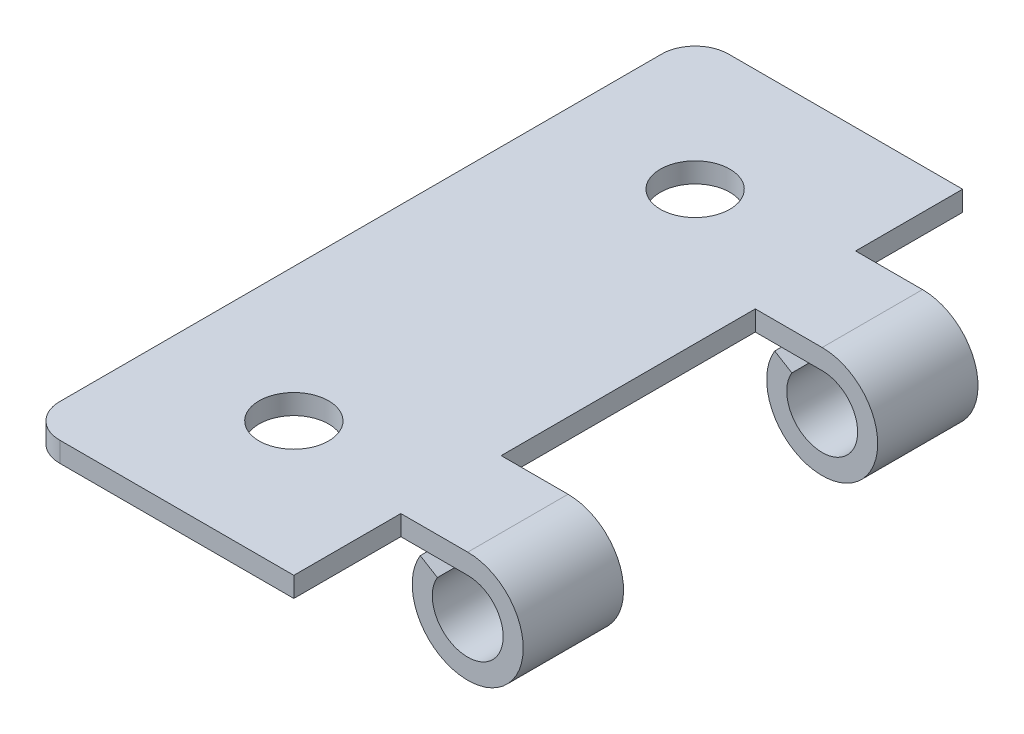
ISO-10303-21;
HEADER;
FILE_DESCRIPTION(('STEP AP214'),'2;1');
FILE_NAME('part.step','',(''),(''),'','','');
FILE_SCHEMA(('AUTOMOTIVE_DESIGN { 1 0 10303 214 1 1 1 1 }'));
ENDSEC;
DATA;
#1=APPLICATION_CONTEXT('core data for automotive mechanical design processes');
#2=APPLICATION_PROTOCOL_DEFINITION('international standard','automotive_design',2000,#1);
#3=PRODUCT_CONTEXT('',#1,'mechanical');
#4=PRODUCT('Part','Part','',(#3));
#5=PRODUCT_RELATED_PRODUCT_CATEGORY('part','',(#4));
#6=PRODUCT_DEFINITION_FORMATION('','',#4);
#7=PRODUCT_DEFINITION_CONTEXT('part definition',#1,'design');
#8=PRODUCT_DEFINITION('design','',#6,#7);
#9=PRODUCT_DEFINITION_SHAPE('','',#8);
#10=(LENGTH_UNIT() NAMED_UNIT(*) SI_UNIT(.MILLI.,.METRE.));
#11=(NAMED_UNIT(*) PLANE_ANGLE_UNIT() SI_UNIT($,.RADIAN.));
#12=(NAMED_UNIT(*) SI_UNIT($,.STERADIAN.) SOLID_ANGLE_UNIT());
#13=UNCERTAINTY_MEASURE_WITH_UNIT(LENGTH_MEASURE(1.E-05),#10,'distance_accuracy_value','');
#14=(GEOMETRIC_REPRESENTATION_CONTEXT(3) GLOBAL_UNCERTAINTY_ASSIGNED_CONTEXT((#13)) GLOBAL_UNIT_ASSIGNED_CONTEXT((#10,
#11,#12)) REPRESENTATION_CONTEXT('',''));
#15=CARTESIAN_POINT('',(0.,0.,0.));
#16=DIRECTION('',(0.,0.,1.));
#17=DIRECTION('',(1.,0.,0.));
#18=AXIS2_PLACEMENT_3D('',#15,#16,#17);
#19=CARTESIAN_POINT('',(12.5,-4.15,25.));
#20=DIRECTION('',(0.,0.,-1.));
#21=DIRECTION('',(-1.,0.,0.));
#22=AXIS2_PLACEMENT_3D('',#19,#20,#21);
#23=CYLINDRICAL_SURFACE('',#22,2.65);
#24=DIRECTION('',(0.,0.,-1.));
#25=VECTOR('',#24,1.);
#26=CARTESIAN_POINT('',(10.2333573843064,-2.77710843373494,25.));
#27=LINE('',#26,#25);
#28=CARTESIAN_POINT('',(10.2333573843064,-2.77710843373494,-9.5));
#29=VERTEX_POINT('',#28);
#30=CARTESIAN_POINT('',(10.2333573843064,-2.77710843373494,-17.));
#31=VERTEX_POINT('',#30);
#32=EDGE_CURVE('E266',#29,#31,#27,.T.);
#33=ORIENTED_EDGE('',*,*,#32,.F.);
#34=CARTESIAN_POINT('',(12.5,-4.15,-9.5));
#35=DIRECTION('',(0.,0.,-1.));
#36=DIRECTION('',(-1.,0.,0.));
#37=AXIS2_PLACEMENT_3D('',#34,#35,#36);
#38=CIRCLE('',#37,2.65);
#39=CARTESIAN_POINT('',(12.5,-1.5,-9.5));
#40=VERTEX_POINT('',#39);
#41=EDGE_CURVE('E212',#29,#40,#38,.F.);
#42=ORIENTED_EDGE('',*,*,#41,.T.);
#43=DIRECTION('',(0.,0.,-1.));
#44=VECTOR('',#43,1.);
#45=CARTESIAN_POINT('',(12.5,-1.5,25.));
#46=LINE('',#45,#44);
#47=CARTESIAN_POINT('',(12.5,-1.5,-17.));
#48=VERTEX_POINT('',#47);
#49=EDGE_CURVE('E251',#40,#48,#46,.T.);
#50=ORIENTED_EDGE('',*,*,#49,.T.);
#51=CARTESIAN_POINT('',(12.5,-4.15,-17.));
#52=DIRECTION('',(0.,0.,1.));
#53=DIRECTION('',(1.,0.,0.));
#54=AXIS2_PLACEMENT_3D('',#51,#52,#53);
#55=CIRCLE('',#54,2.65);
#56=EDGE_CURVE('E237',#48,#31,#55,.F.);
#57=ORIENTED_EDGE('',*,*,#56,.T.);
#58=EDGE_LOOP('',(#33,#42,#50,#57));
#59=FACE_BOUND('',#58,.T.);
#60=ADVANCED_FACE('F38',(#59),#23,.F.);
#61=CARTESIAN_POINT('',(8.95035213014023,-2.,25.));
#62=DIRECTION('',(0.518072289156626,0.855336836110788,0.));
#63=DIRECTION('',(-0.855336836110788,0.518072289156627,0.));
#64=AXIS2_PLACEMENT_3D('',#61,#62,#63);
#65=PLANE('',#64);
#66=DIRECTION('',(-0.855336836110788,0.518072289156627,0.));
#67=VECTOR('',#66,1.);
#68=CARTESIAN_POINT('',(8.95035213014023,-2.,-9.5));
#69=LINE('',#68,#67);
#70=CARTESIAN_POINT('',(8.95035213014023,-2.,-9.5));
#71=VERTEX_POINT('',#70);
#72=EDGE_CURVE('E215',#29,#71,#69,.T.);
#73=ORIENTED_EDGE('',*,*,#72,.F.);
#74=ORIENTED_EDGE('',*,*,#32,.T.);
#75=DIRECTION('',(0.855336836110788,-0.518072289156627,0.));
#76=VECTOR('',#75,1.);
#77=CARTESIAN_POINT('',(8.95035213014023,-2.,-17.));
#78=LINE('',#77,#76);
#79=CARTESIAN_POINT('',(8.95035213014023,-2.,-17.));
#80=VERTEX_POINT('',#79);
#81=EDGE_CURVE('E240',#80,#31,#78,.T.);
#82=ORIENTED_EDGE('',*,*,#81,.F.);
#83=DIRECTION('',(0.,0.,-1.));
#84=VECTOR('',#83,1.);
#85=CARTESIAN_POINT('',(8.95035213014023,-2.,25.));
#86=LINE('',#85,#84);
#87=EDGE_CURVE('E263',#71,#80,#86,.T.);
#88=ORIENTED_EDGE('',*,*,#87,.F.);
#89=EDGE_LOOP('',(#73,#74,#82,#88));
#90=FACE_BOUND('',#89,.T.);
#91=ADVANCED_FACE('F363',(#90),#65,.T.);
#92=CARTESIAN_POINT('',(12.5,-4.15,25.));
#93=DIRECTION('',(0.,0.,-1.));
#94=DIRECTION('',(-1.,0.,0.));
#95=AXIS2_PLACEMENT_3D('',#92,#93,#94);
#96=CYLINDRICAL_SURFACE('',#95,4.15);
#97=CARTESIAN_POINT('',(12.5,-4.15,-9.5));
#98=DIRECTION('',(0.,0.,-1.));
#99=DIRECTION('',(-1.,0.,0.));
#100=AXIS2_PLACEMENT_3D('',#97,#98,#99);
#101=CIRCLE('',#100,4.15);
#102=CARTESIAN_POINT('',(12.5,0.,-9.5));
#103=VERTEX_POINT('',#102);
#104=EDGE_CURVE('E218',#71,#103,#101,.F.);
#105=ORIENTED_EDGE('',*,*,#104,.F.);
#106=ORIENTED_EDGE('',*,*,#87,.T.);
#107=CARTESIAN_POINT('',(12.5,-4.15,-17.));
#108=DIRECTION('',(0.,0.,1.));
#109=DIRECTION('',(1.,0.,0.));
#110=AXIS2_PLACEMENT_3D('',#107,#108,#109);
#111=CIRCLE('',#110,4.15);
#112=CARTESIAN_POINT('',(12.5,0.,-17.));
#113=VERTEX_POINT('',#112);
#114=EDGE_CURVE('E243',#113,#80,#111,.F.);
#115=ORIENTED_EDGE('',*,*,#114,.F.);
#116=DIRECTION('',(0.,0.,-1.));
#117=VECTOR('',#116,1.);
#118=CARTESIAN_POINT('',(12.5,0.,25.));
#119=LINE('',#118,#117);
#120=EDGE_CURVE('E260',#103,#113,#119,.T.);
#121=ORIENTED_EDGE('',*,*,#120,.F.);
#122=EDGE_LOOP('',(#105,#106,#115,#121));
#123=FACE_BOUND('',#122,.T.);
#124=ADVANCED_FACE('F355',(#123),#96,.T.);
#125=CARTESIAN_POINT('',(10.2333573843064,-2.77710843373494,17.));
#126=VERTEX_POINT('',#125);
#127=CARTESIAN_POINT('',(10.2333573843064,-2.77710843373494,9.5));
#128=VERTEX_POINT('',#127);
#129=EDGE_CURVE('E268',#126,#128,#27,.T.);
#130=ORIENTED_EDGE('',*,*,#129,.F.);
#131=CARTESIAN_POINT('',(12.5,-4.15,17.));
#132=DIRECTION('',(0.,0.,-1.));
#133=DIRECTION('',(-1.,0.,0.));
#134=AXIS2_PLACEMENT_3D('',#131,#132,#133);
#135=CIRCLE('',#134,2.65);
#136=CARTESIAN_POINT('',(12.5,-1.5,17.));
#137=VERTEX_POINT('',#136);
#138=EDGE_CURVE('E220',#126,#137,#135,.F.);
#139=ORIENTED_EDGE('',*,*,#138,.T.);
#140=CARTESIAN_POINT('',(12.5,-1.5,9.5));
#141=VERTEX_POINT('',#140);
#142=EDGE_CURVE('E255',#137,#141,#46,.T.);
#143=ORIENTED_EDGE('',*,*,#142,.T.);
#144=CARTESIAN_POINT('',(12.5,-4.15,9.5));
#145=DIRECTION('',(0.,0.,1.));
#146=DIRECTION('',(1.,0.,0.));
#147=AXIS2_PLACEMENT_3D('',#144,#145,#146);
#148=CIRCLE('',#147,2.65);
#149=EDGE_CURVE('E205',#141,#128,#148,.F.);
#150=ORIENTED_EDGE('',*,*,#149,.T.);
#151=EDGE_LOOP('',(#130,#139,#143,#150));
#152=FACE_BOUND('',#151,.T.);
#153=ADVANCED_FACE('F330',(#152),#23,.F.);
#154=DIRECTION('',(-0.855336836110788,0.518072289156627,0.));
#155=VECTOR('',#154,1.);
#156=CARTESIAN_POINT('',(8.95035213014023,-2.,17.));
#157=LINE('',#156,#155);
#158=CARTESIAN_POINT('',(8.95035213014023,-2.,17.));
#159=VERTEX_POINT('',#158);
#160=EDGE_CURVE('E223',#126,#159,#157,.T.);
#161=ORIENTED_EDGE('',*,*,#160,.F.);
#162=ORIENTED_EDGE('',*,*,#129,.T.);
#163=DIRECTION('',(0.855336836110788,-0.518072289156627,0.));
#164=VECTOR('',#163,1.);
#165=CARTESIAN_POINT('',(8.95035213014023,-2.,9.5));
#166=LINE('',#165,#164);
#167=CARTESIAN_POINT('',(8.95035213014023,-2.,9.5));
#168=VERTEX_POINT('',#167);
#169=EDGE_CURVE('E208',#168,#128,#166,.T.);
#170=ORIENTED_EDGE('',*,*,#169,.F.);
#171=EDGE_CURVE('E265',#159,#168,#86,.T.);
#172=ORIENTED_EDGE('',*,*,#171,.F.);
#173=EDGE_LOOP('',(#161,#162,#170,#172));
#174=FACE_BOUND('',#173,.T.);
#175=ADVANCED_FACE('F334',(#174),#65,.T.);
#176=CARTESIAN_POINT('',(12.5,-4.15,17.));
#177=DIRECTION('',(0.,0.,-1.));
#178=DIRECTION('',(-1.,0.,0.));
#179=AXIS2_PLACEMENT_3D('',#176,#177,#178);
#180=CIRCLE('',#179,4.15);
#181=CARTESIAN_POINT('',(12.5,0.,17.));
#182=VERTEX_POINT('',#181);
#183=EDGE_CURVE('E180',#159,#182,#180,.F.);
#184=ORIENTED_EDGE('',*,*,#183,.F.);
#185=ORIENTED_EDGE('',*,*,#171,.T.);
#186=CARTESIAN_POINT('',(12.5,-4.15,9.5));
#187=DIRECTION('',(0.,0.,1.));
#188=DIRECTION('',(1.,0.,0.));
#189=AXIS2_PLACEMENT_3D('',#186,#187,#188);
#190=CIRCLE('',#189,4.15);
#191=CARTESIAN_POINT('',(12.5,0.,9.5));
#192=VERTEX_POINT('',#191);
#193=EDGE_CURVE('E210',#192,#168,#190,.F.);
#194=ORIENTED_EDGE('',*,*,#193,.F.);
#195=EDGE_CURVE('E262',#182,#192,#119,.T.);
#196=ORIENTED_EDGE('',*,*,#195,.F.);
#197=EDGE_LOOP('',(#184,#185,#194,#196));
#198=FACE_BOUND('',#197,.T.);
#199=ADVANCED_FACE('F339',(#198),#96,.T.);
#200=CARTESIAN_POINT('',(-12.5,0.,25.));
#201=DIRECTION('',(0.,1.,0.));
#202=DIRECTION('',(-1.,0.,0.));
#203=AXIS2_PLACEMENT_3D('',#200,#201,#202);
#204=PLANE('',#203);
#205=CARTESIAN_POINT('',(-2.5,0.,15.));
#206=DIRECTION('',(0.,1.,0.));
#207=DIRECTION('',(-1.,0.,0.));
#208=AXIS2_PLACEMENT_3D('',#205,#206,#207);
#209=CIRCLE('',#208,2.6);
#210=CARTESIAN_POINT('',(-5.1,0.,15.));
#211=VERTEX_POINT('',#210);
#212=EDGE_CURVE('E295',#211,#211,#209,.T.);
#213=ORIENTED_EDGE('',*,*,#212,.F.);
#214=EDGE_LOOP('',(#213));
#215=FACE_BOUND('',#214,.T.);
#216=CARTESIAN_POINT('',(-2.5,0.,-15.));
#217=DIRECTION('',(0.,1.,0.));
#218=DIRECTION('',(-1.,0.,0.));
#219=AXIS2_PLACEMENT_3D('',#216,#217,#218);
#220=CIRCLE('',#219,2.6);
#221=CARTESIAN_POINT('',(-5.1,0.,-15.));
#222=VERTEX_POINT('',#221);
#223=EDGE_CURVE('E291',#222,#222,#220,.T.);
#224=ORIENTED_EDGE('',*,*,#223,.F.);
#225=EDGE_LOOP('',(#224));
#226=FACE_BOUND('',#225,.T.);
#227=DIRECTION('',(1.,0.,0.));
#228=VECTOR('',#227,1.);
#229=CARTESIAN_POINT('',(-12.5,0.,-25.));
#230=LINE('',#229,#228);
#231=CARTESIAN_POINT('',(-10.,0.,-25.));
#232=VERTEX_POINT('',#231);
#233=CARTESIAN_POINT('',(7.5,0.,-25.));
#234=VERTEX_POINT('',#233);
#235=EDGE_CURVE('E246',#232,#234,#230,.T.);
#236=ORIENTED_EDGE('',*,*,#235,.F.);
#237=CARTESIAN_POINT('',(-10.,0.,-22.5));
#238=DIRECTION('',(0.,1.,0.));
#239=DIRECTION('',(-1.,0.,0.));
#240=AXIS2_PLACEMENT_3D('',#237,#238,#239);
#241=CIRCLE('',#240,2.5);
#242=CARTESIAN_POINT('',(-12.5,0.,-22.5));
#243=VERTEX_POINT('',#242);
#244=EDGE_CURVE('E300',#232,#243,#241,.T.);
#245=ORIENTED_EDGE('',*,*,#244,.T.);
#246=DIRECTION('',(0.,0.,-1.));
#247=VECTOR('',#246,1.);
#248=CARTESIAN_POINT('',(-12.5,0.,25.));
#249=LINE('',#248,#247);
#250=CARTESIAN_POINT('',(-12.5,0.,22.5));
#251=VERTEX_POINT('',#250);
#252=EDGE_CURVE('E258',#251,#243,#249,.T.);
#253=ORIENTED_EDGE('',*,*,#252,.F.);
#254=CARTESIAN_POINT('',(-10.,0.,22.5));
#255=DIRECTION('',(0.,1.,0.));
#256=DIRECTION('',(-1.,0.,0.));
#257=AXIS2_PLACEMENT_3D('',#254,#255,#256);
#258=CIRCLE('',#257,2.5);
#259=CARTESIAN_POINT('',(-10.,0.,25.));
#260=VERTEX_POINT('',#259);
#261=EDGE_CURVE('E298',#251,#260,#258,.T.);
#262=ORIENTED_EDGE('',*,*,#261,.T.);
#263=DIRECTION('',(1.,0.,0.));
#264=VECTOR('',#263,1.);
#265=CARTESIAN_POINT('',(-12.5,0.,25.));
#266=LINE('',#265,#264);
#267=CARTESIAN_POINT('',(7.5,0.,25.));
#268=VERTEX_POINT('',#267);
#269=EDGE_CURVE('E188',#260,#268,#266,.T.);
#270=ORIENTED_EDGE('',*,*,#269,.T.);
#271=DIRECTION('',(0.,0.,1.));
#272=VECTOR('',#271,1.);
#273=CARTESIAN_POINT('',(7.5,0.,25.));
#274=LINE('',#273,#272);
#275=CARTESIAN_POINT('',(7.5,0.,17.));
#276=VERTEX_POINT('',#275);
#277=EDGE_CURVE('E169',#276,#268,#274,.T.);
#278=ORIENTED_EDGE('',*,*,#277,.F.);
#279=DIRECTION('',(-1.,0.,0.));
#280=VECTOR('',#279,1.);
#281=CARTESIAN_POINT('',(16.65,0.,17.));
#282=LINE('',#281,#280);
#283=EDGE_CURVE('E177',#182,#276,#282,.T.);
#284=ORIENTED_EDGE('',*,*,#283,.F.);
#285=ORIENTED_EDGE('',*,*,#195,.T.);
#286=DIRECTION('',(1.,0.,0.));
#287=VECTOR('',#286,1.);
#288=CARTESIAN_POINT('',(7.5,0.,9.5));
#289=LINE('',#288,#287);
#290=CARTESIAN_POINT('',(7.5,0.,9.5));
#291=VERTEX_POINT('',#290);
#292=EDGE_CURVE('E195',#291,#192,#289,.T.);
#293=ORIENTED_EDGE('',*,*,#292,.F.);
#294=DIRECTION('',(0.,0.,1.));
#295=VECTOR('',#294,1.);
#296=CARTESIAN_POINT('',(7.5,0.,-9.5));
#297=LINE('',#296,#295);
#298=CARTESIAN_POINT('',(7.5,0.,-9.5));
#299=VERTEX_POINT('',#298);
#300=EDGE_CURVE('E192',#299,#291,#297,.T.);
#301=ORIENTED_EDGE('',*,*,#300,.F.);
#302=DIRECTION('',(-1.,0.,0.));
#303=VECTOR('',#302,1.);
#304=CARTESIAN_POINT('',(7.5,0.,-9.5));
#305=LINE('',#304,#303);
#306=EDGE_CURVE('E198',#103,#299,#305,.T.);
#307=ORIENTED_EDGE('',*,*,#306,.F.);
#308=ORIENTED_EDGE('',*,*,#120,.T.);
#309=DIRECTION('',(1.,0.,0.));
#310=VECTOR('',#309,1.);
#311=CARTESIAN_POINT('',(16.65,0.,-17.));
#312=LINE('',#311,#310);
#313=CARTESIAN_POINT('',(7.5,0.,-17.));
#314=VERTEX_POINT('',#313);
#315=EDGE_CURVE('E229',#314,#113,#312,.T.);
#316=ORIENTED_EDGE('',*,*,#315,.F.);
#317=DIRECTION('',(0.,0.,1.));
#318=VECTOR('',#317,1.);
#319=CARTESIAN_POINT('',(7.5,0.,-25.));
#320=LINE('',#319,#318);
#321=EDGE_CURVE('E226',#234,#314,#320,.T.);
#322=ORIENTED_EDGE('',*,*,#321,.F.);
#323=EDGE_LOOP('',(#236,#245,#253,#262,#270,#278,#284,#285,#293,#301,#307,#308,#316,#322));
#324=FACE_BOUND('',#323,.T.);
#325=ADVANCED_FACE('F187',(#215,#226,#324),#204,.T.);
#326=CARTESIAN_POINT('',(-12.5,-1.5,25.));
#327=DIRECTION('',(-1.,0.,0.));
#328=DIRECTION('',(0.,0.,1.));
#329=AXIS2_PLACEMENT_3D('',#326,#327,#328);
#330=PLANE('',#329);
#331=ORIENTED_EDGE('',*,*,#252,.T.);
#332=DIRECTION('',(0.,1.,0.));
#333=VECTOR('',#332,1.);
#334=CARTESIAN_POINT('',(-12.5,-1.5,-22.5));
#335=LINE('',#334,#333);
#336=CARTESIAN_POINT('',(-12.5,-1.5,-22.5));
#337=VERTEX_POINT('',#336);
#338=EDGE_CURVE('E59',#243,#337,#335,.F.);
#339=ORIENTED_EDGE('',*,*,#338,.T.);
#340=DIRECTION('',(0.,0.,-1.));
#341=VECTOR('',#340,1.);
#342=CARTESIAN_POINT('',(-12.5,-1.5,25.));
#343=LINE('',#342,#341);
#344=CARTESIAN_POINT('',(-12.5,-1.5,22.5));
#345=VERTEX_POINT('',#344);
#346=EDGE_CURVE('E256',#345,#337,#343,.T.);
#347=ORIENTED_EDGE('',*,*,#346,.F.);
#348=DIRECTION('',(0.,1.,0.));
#349=VECTOR('',#348,1.);
#350=CARTESIAN_POINT('',(-12.5,-1.5,22.5));
#351=LINE('',#350,#349);
#352=EDGE_CURVE('E302',#345,#251,#351,.T.);
#353=ORIENTED_EDGE('',*,*,#352,.T.);
#354=EDGE_LOOP('',(#331,#339,#347,#353));
#355=FACE_BOUND('',#354,.T.);
#356=ADVANCED_FACE('F320',(#355),#330,.T.);
#357=CARTESIAN_POINT('',(-12.5,-1.5,25.));
#358=DIRECTION('',(0.,1.,0.));
#359=DIRECTION('',(-1.,0.,0.));
#360=AXIS2_PLACEMENT_3D('',#357,#358,#359);
#361=PLANE('',#360);
#362=CARTESIAN_POINT('',(-2.5,-1.5,15.));
#363=DIRECTION('',(0.,1.,0.));
#364=DIRECTION('',(-1.,0.,0.));
#365=AXIS2_PLACEMENT_3D('',#362,#363,#364);
#366=CIRCLE('',#365,2.6);
#367=CARTESIAN_POINT('',(-5.1,-1.5,15.));
#368=VERTEX_POINT('',#367);
#369=EDGE_CURVE('E292',#368,#368,#366,.T.);
#370=ORIENTED_EDGE('',*,*,#369,.T.);
#371=EDGE_LOOP('',(#370));
#372=FACE_BOUND('',#371,.T.);
#373=CARTESIAN_POINT('',(-2.5,-1.5,-15.));
#374=DIRECTION('',(0.,1.,0.));
#375=DIRECTION('',(-1.,0.,0.));
#376=AXIS2_PLACEMENT_3D('',#373,#374,#375);
#377=CIRCLE('',#376,2.6);
#378=CARTESIAN_POINT('',(-5.1,-1.5,-15.));
#379=VERTEX_POINT('',#378);
#380=EDGE_CURVE('E196',#379,#379,#377,.T.);
#381=ORIENTED_EDGE('',*,*,#380,.T.);
#382=EDGE_LOOP('',(#381));
#383=FACE_BOUND('',#382,.T.);
#384=ORIENTED_EDGE('',*,*,#346,.T.);
#385=CARTESIAN_POINT('',(-10.,-1.5,-22.5));
#386=DIRECTION('',(0.,1.,0.));
#387=DIRECTION('',(-1.,0.,0.));
#388=AXIS2_PLACEMENT_3D('',#385,#386,#387);
#389=CIRCLE('',#388,2.5);
#390=CARTESIAN_POINT('',(-10.,-1.5,-25.));
#391=VERTEX_POINT('',#390);
#392=EDGE_CURVE('E46',#337,#391,#389,.F.);
#393=ORIENTED_EDGE('',*,*,#392,.T.);
#394=DIRECTION('',(1.,0.,0.));
#395=VECTOR('',#394,1.);
#396=CARTESIAN_POINT('',(-12.5,-1.5,-25.));
#397=LINE('',#396,#395);
#398=CARTESIAN_POINT('',(7.5,-1.5,-25.));
#399=VERTEX_POINT('',#398);
#400=EDGE_CURVE('E249',#391,#399,#397,.T.);
#401=ORIENTED_EDGE('',*,*,#400,.T.);
#402=DIRECTION('',(0.,0.,1.));
#403=VECTOR('',#402,1.);
#404=CARTESIAN_POINT('',(7.50000000000001,-1.5,25.));
#405=LINE('',#404,#403);
#406=CARTESIAN_POINT('',(7.5,-1.5,-17.));
#407=VERTEX_POINT('',#406);
#408=EDGE_CURVE('E234',#399,#407,#405,.T.);
#409=ORIENTED_EDGE('',*,*,#408,.T.);
#410=DIRECTION('',(1.,0.,0.));
#411=VECTOR('',#410,1.);
#412=CARTESIAN_POINT('',(-12.5,-1.5,-17.));
#413=LINE('',#412,#411);
#414=EDGE_CURVE('E272',#407,#48,#413,.T.);
#415=ORIENTED_EDGE('',*,*,#414,.T.);
#416=ORIENTED_EDGE('',*,*,#49,.F.);
#417=DIRECTION('',(-1.,0.,0.));
#418=VECTOR('',#417,1.);
#419=CARTESIAN_POINT('',(-12.5,-1.5,-9.5));
#420=LINE('',#419,#418);
#421=CARTESIAN_POINT('',(7.5,-1.5,-9.5));
#422=VERTEX_POINT('',#421);
#423=EDGE_CURVE('E283',#40,#422,#420,.T.);
#424=ORIENTED_EDGE('',*,*,#423,.T.);
#425=DIRECTION('',(0.,0.,1.));
#426=VECTOR('',#425,1.);
#427=CARTESIAN_POINT('',(7.5,-1.5,25.));
#428=LINE('',#427,#426);
#429=CARTESIAN_POINT('',(7.5,-1.5,9.5));
#430=VERTEX_POINT('',#429);
#431=EDGE_CURVE('E280',#422,#430,#428,.T.);
#432=ORIENTED_EDGE('',*,*,#431,.T.);
#433=DIRECTION('',(1.,0.,0.));
#434=VECTOR('',#433,1.);
#435=CARTESIAN_POINT('',(-12.5,-1.5,9.5));
#436=LINE('',#435,#434);
#437=EDGE_CURVE('E277',#430,#141,#436,.T.);
#438=ORIENTED_EDGE('',*,*,#437,.T.);
#439=ORIENTED_EDGE('',*,*,#142,.F.);
#440=DIRECTION('',(-1.,0.,0.));
#441=VECTOR('',#440,1.);
#442=CARTESIAN_POINT('',(-12.5,-1.5,17.));
#443=LINE('',#442,#441);
#444=CARTESIAN_POINT('',(7.5,-1.5,17.));
#445=VERTEX_POINT('',#444);
#446=EDGE_CURVE('E286',#137,#445,#443,.T.);
#447=ORIENTED_EDGE('',*,*,#446,.T.);
#448=DIRECTION('',(0.,0.,1.));
#449=VECTOR('',#448,1.);
#450=CARTESIAN_POINT('',(7.5,-1.5,25.));
#451=LINE('',#450,#449);
#452=CARTESIAN_POINT('',(7.5,-1.5,25.));
#453=VERTEX_POINT('',#452);
#454=EDGE_CURVE('E172',#445,#453,#451,.T.);
#455=ORIENTED_EDGE('',*,*,#454,.T.);
#456=DIRECTION('',(1.,0.,0.));
#457=VECTOR('',#456,1.);
#458=CARTESIAN_POINT('',(-12.5,-1.5,25.));
#459=LINE('',#458,#457);
#460=CARTESIAN_POINT('',(-10.,-1.5,25.));
#461=VERTEX_POINT('',#460);
#462=EDGE_CURVE('E248',#461,#453,#459,.T.);
#463=ORIENTED_EDGE('',*,*,#462,.F.);
#464=CARTESIAN_POINT('',(-10.,-1.5,22.5));
#465=DIRECTION('',(0.,1.,0.));
#466=DIRECTION('',(-1.,0.,0.));
#467=AXIS2_PLACEMENT_3D('',#464,#465,#466);
#468=CIRCLE('',#467,2.5);
#469=EDGE_CURVE('E306',#461,#345,#468,.F.);
#470=ORIENTED_EDGE('',*,*,#469,.T.);
#471=EDGE_LOOP('',(#384,#393,#401,#409,#415,#416,#424,#432,#438,#439,#447,#455,#463,#470));
#472=FACE_BOUND('',#471,.T.);
#473=ADVANCED_FACE('F310',(#372,#383,#472),#361,.F.);
#474=CARTESIAN_POINT('',(12.5,-4.15,25.));
#475=DIRECTION('',(0.,0.,1.));
#476=DIRECTION('',(1.,0.,0.));
#477=AXIS2_PLACEMENT_3D('',#474,#475,#476);
#478=PLANE('',#477);
#479=ORIENTED_EDGE('',*,*,#269,.F.);
#480=DIRECTION('',(0.,1.,0.));
#481=VECTOR('',#480,1.);
#482=CARTESIAN_POINT('',(-10.,-4.15,25.));
#483=LINE('',#482,#481);
#484=EDGE_CURVE('E11',#260,#461,#483,.F.);
#485=ORIENTED_EDGE('',*,*,#484,.T.);
#486=ORIENTED_EDGE('',*,*,#462,.T.);
#487=DIRECTION('',(0.,-1.,0.));
#488=VECTOR('',#487,1.);
#489=CARTESIAN_POINT('',(7.5,-4.15,25.));
#490=LINE('',#489,#488);
#491=EDGE_CURVE('E275',#268,#453,#490,.T.);
#492=ORIENTED_EDGE('',*,*,#491,.F.);
#493=EDGE_LOOP('',(#479,#485,#486,#492));
#494=FACE_BOUND('',#493,.T.);
#495=ADVANCED_FACE('F324',(#494),#478,.T.);
#496=CARTESIAN_POINT('',(12.5,-4.15,-25.));
#497=DIRECTION('',(0.,0.,1.));
#498=DIRECTION('',(1.,0.,0.));
#499=AXIS2_PLACEMENT_3D('',#496,#497,#498);
#500=PLANE('',#499);
#501=ORIENTED_EDGE('',*,*,#400,.F.);
#502=DIRECTION('',(0.,1.,0.));
#503=VECTOR('',#502,1.);
#504=CARTESIAN_POINT('',(-10.,0.,-25.));
#505=LINE('',#504,#503);
#506=EDGE_CURVE('E288',#391,#232,#505,.T.);
#507=ORIENTED_EDGE('',*,*,#506,.T.);
#508=ORIENTED_EDGE('',*,*,#235,.T.);
#509=DIRECTION('',(0.,-1.,0.));
#510=VECTOR('',#509,1.);
#511=CARTESIAN_POINT('',(7.5,-4.15,-25.));
#512=LINE('',#511,#510);
#513=EDGE_CURVE('E269',#234,#399,#512,.T.);
#514=ORIENTED_EDGE('',*,*,#513,.T.);
#515=EDGE_LOOP('',(#501,#507,#508,#514));
#516=FACE_BOUND('',#515,.T.);
#517=ADVANCED_FACE('F315',(#516),#500,.F.);
#518=CARTESIAN_POINT('',(7.5,-8.3,-25.));
#519=DIRECTION('',(-1.,0.,0.));
#520=DIRECTION('',(0.,0.,1.));
#521=AXIS2_PLACEMENT_3D('',#518,#519,#520);
#522=PLANE('',#521);
#523=ORIENTED_EDGE('',*,*,#513,.F.);
#524=ORIENTED_EDGE('',*,*,#321,.T.);
#525=DIRECTION('',(0.,1.,0.));
#526=VECTOR('',#525,1.);
#527=CARTESIAN_POINT('',(7.5,-8.3,-17.));
#528=LINE('',#527,#526);
#529=EDGE_CURVE('E232',#407,#314,#528,.T.);
#530=ORIENTED_EDGE('',*,*,#529,.F.);
#531=ORIENTED_EDGE('',*,*,#408,.F.);
#532=EDGE_LOOP('',(#523,#524,#530,#531));
#533=FACE_BOUND('',#532,.T.);
#534=ADVANCED_FACE('F369',(#533),#522,.F.);
#535=CARTESIAN_POINT('',(16.65,-8.3,-17.));
#536=DIRECTION('',(0.,0.,1.));
#537=DIRECTION('',(1.,0.,0.));
#538=AXIS2_PLACEMENT_3D('',#535,#536,#537);
#539=PLANE('',#538);
#540=ORIENTED_EDGE('',*,*,#114,.T.);
#541=ORIENTED_EDGE('',*,*,#81,.T.);
#542=ORIENTED_EDGE('',*,*,#56,.F.);
#543=ORIENTED_EDGE('',*,*,#414,.F.);
#544=ORIENTED_EDGE('',*,*,#529,.T.);
#545=ORIENTED_EDGE('',*,*,#315,.T.);
#546=EDGE_LOOP('',(#540,#541,#542,#543,#544,#545));
#547=FACE_BOUND('',#546,.T.);
#548=ADVANCED_FACE('F359',(#547),#539,.F.);
#549=CARTESIAN_POINT('',(7.5,-8.3,25.));
#550=DIRECTION('',(-1.,0.,0.));
#551=DIRECTION('',(0.,0.,1.));
#552=AXIS2_PLACEMENT_3D('',#549,#550,#551);
#553=PLANE('',#552);
#554=DIRECTION('',(0.,1.,0.));
#555=VECTOR('',#554,1.);
#556=CARTESIAN_POINT('',(7.5,-8.3,17.));
#557=LINE('',#556,#555);
#558=EDGE_CURVE('E164',#445,#276,#557,.T.);
#559=ORIENTED_EDGE('',*,*,#558,.T.);
#560=ORIENTED_EDGE('',*,*,#277,.T.);
#561=ORIENTED_EDGE('',*,*,#491,.T.);
#562=ORIENTED_EDGE('',*,*,#454,.F.);
#563=EDGE_LOOP('',(#559,#560,#561,#562));
#564=FACE_BOUND('',#563,.T.);
#565=ADVANCED_FACE('F166',(#564),#553,.F.);
#566=CARTESIAN_POINT('',(16.65,-8.3,17.));
#567=DIRECTION('',(0.,0.,-1.));
#568=DIRECTION('',(-1.,0.,0.));
#569=AXIS2_PLACEMENT_3D('',#566,#567,#568);
#570=PLANE('',#569);
#571=ORIENTED_EDGE('',*,*,#183,.T.);
#572=ORIENTED_EDGE('',*,*,#283,.T.);
#573=ORIENTED_EDGE('',*,*,#558,.F.);
#574=ORIENTED_EDGE('',*,*,#446,.F.);
#575=ORIENTED_EDGE('',*,*,#138,.F.);
#576=ORIENTED_EDGE('',*,*,#160,.T.);
#577=EDGE_LOOP('',(#571,#572,#573,#574,#575,#576));
#578=FACE_BOUND('',#577,.T.);
#579=ADVANCED_FACE('F178',(#578),#570,.F.);
#580=CARTESIAN_POINT('',(7.5,-8.3,-9.5));
#581=DIRECTION('',(-1.,0.,0.));
#582=DIRECTION('',(0.,-1.,0.));
#583=AXIS2_PLACEMENT_3D('',#580,#581,#582);
#584=PLANE('',#583);
#585=DIRECTION('',(0.,1.,0.));
#586=VECTOR('',#585,1.);
#587=CARTESIAN_POINT('',(7.5,-8.3,-9.5));
#588=LINE('',#587,#586);
#589=EDGE_CURVE('E184',#422,#299,#588,.T.);
#590=ORIENTED_EDGE('',*,*,#589,.T.);
#591=ORIENTED_EDGE('',*,*,#300,.T.);
#592=DIRECTION('',(0.,1.,0.));
#593=VECTOR('',#592,1.);
#594=CARTESIAN_POINT('',(7.5,-8.3,9.5));
#595=LINE('',#594,#593);
#596=EDGE_CURVE('E201',#430,#291,#595,.T.);
#597=ORIENTED_EDGE('',*,*,#596,.F.);
#598=ORIENTED_EDGE('',*,*,#431,.F.);
#599=EDGE_LOOP('',(#590,#591,#597,#598));
#600=FACE_BOUND('',#599,.T.);
#601=ADVANCED_FACE('F347',(#600),#584,.F.);
#602=CARTESIAN_POINT('',(7.5,-8.3,-9.5));
#603=DIRECTION('',(0.,0.,-1.));
#604=DIRECTION('',(-1.,0.,0.));
#605=AXIS2_PLACEMENT_3D('',#602,#603,#604);
#606=PLANE('',#605);
#607=ORIENTED_EDGE('',*,*,#104,.T.);
#608=ORIENTED_EDGE('',*,*,#306,.T.);
#609=ORIENTED_EDGE('',*,*,#589,.F.);
#610=ORIENTED_EDGE('',*,*,#423,.F.);
#611=ORIENTED_EDGE('',*,*,#41,.F.);
#612=ORIENTED_EDGE('',*,*,#72,.T.);
#613=EDGE_LOOP('',(#607,#608,#609,#610,#611,#612));
#614=FACE_BOUND('',#613,.T.);
#615=ADVANCED_FACE('F350',(#614),#606,.F.);
#616=CARTESIAN_POINT('',(7.5,-8.3,9.5));
#617=DIRECTION('',(0.,0.,1.));
#618=DIRECTION('',(1.,0.,0.));
#619=AXIS2_PLACEMENT_3D('',#616,#617,#618);
#620=PLANE('',#619);
#621=ORIENTED_EDGE('',*,*,#193,.T.);
#622=ORIENTED_EDGE('',*,*,#169,.T.);
#623=ORIENTED_EDGE('',*,*,#149,.F.);
#624=ORIENTED_EDGE('',*,*,#437,.F.);
#625=ORIENTED_EDGE('',*,*,#596,.T.);
#626=ORIENTED_EDGE('',*,*,#292,.T.);
#627=EDGE_LOOP('',(#621,#622,#623,#624,#625,#626));
#628=FACE_BOUND('',#627,.T.);
#629=ADVANCED_FACE('F344',(#628),#620,.F.);
#630=CARTESIAN_POINT('',(-2.5,-10.,-15.));
#631=DIRECTION('',(0.,1.,0.));
#632=DIRECTION('',(-1.,0.,0.));
#633=AXIS2_PLACEMENT_3D('',#630,#631,#632);
#634=CYLINDRICAL_SURFACE('',#633,2.6);
#635=ORIENTED_EDGE('',*,*,#223,.T.);
#636=EDGE_LOOP('',(#635));
#637=FACE_BOUND('',#636,.T.);
#638=ORIENTED_EDGE('',*,*,#380,.F.);
#639=EDGE_LOOP('',(#638));
#640=FACE_BOUND('',#639,.T.);
#641=ADVANCED_FACE('F443',(#637,#640),#634,.F.);
#642=CARTESIAN_POINT('',(-2.5,-10.,15.));
#643=DIRECTION('',(0.,1.,0.));
#644=DIRECTION('',(-1.,0.,0.));
#645=AXIS2_PLACEMENT_3D('',#642,#643,#644);
#646=CYLINDRICAL_SURFACE('',#645,2.6);
#647=ORIENTED_EDGE('',*,*,#212,.T.);
#648=EDGE_LOOP('',(#647));
#649=FACE_BOUND('',#648,.T.);
#650=ORIENTED_EDGE('',*,*,#369,.F.);
#651=EDGE_LOOP('',(#650));
#652=FACE_BOUND('',#651,.T.);
#653=ADVANCED_FACE('F428',(#649,#652),#646,.F.);
#654=CARTESIAN_POINT('',(-10.,-4.15,-22.5));
#655=DIRECTION('',(0.,-1.,0.));
#656=DIRECTION('',(0.,0.,-1.));
#657=AXIS2_PLACEMENT_3D('',#654,#655,#656);
#658=CYLINDRICAL_SURFACE('',#657,2.5);
#659=ORIENTED_EDGE('',*,*,#392,.F.);
#660=ORIENTED_EDGE('',*,*,#338,.F.);
#661=ORIENTED_EDGE('',*,*,#244,.F.);
#662=ORIENTED_EDGE('',*,*,#506,.F.);
#663=EDGE_LOOP('',(#659,#660,#661,#662));
#664=FACE_BOUND('',#663,.T.);
#665=ADVANCED_FACE('F317',(#664),#658,.T.);
#666=CARTESIAN_POINT('',(-10.,-1.5,22.5));
#667=DIRECTION('',(0.,1.,0.));
#668=DIRECTION('',(0.,0.,1.));
#669=AXIS2_PLACEMENT_3D('',#666,#667,#668);
#670=CYLINDRICAL_SURFACE('',#669,2.5);
#671=ORIENTED_EDGE('',*,*,#469,.F.);
#672=ORIENTED_EDGE('',*,*,#484,.F.);
#673=ORIENTED_EDGE('',*,*,#261,.F.);
#674=ORIENTED_EDGE('',*,*,#352,.F.);
#675=EDGE_LOOP('',(#671,#672,#673,#674));
#676=FACE_BOUND('',#675,.T.);
#677=ADVANCED_FACE('F40',(#676),#670,.T.);
#678=CLOSED_SHELL('',(#60,#91,#124,#153,#175,#199,#325,#356,#473,#495,#517,#534,#548,#565,#579,
#601,#615,#629,#641,#653,#665,#677));
#679=MANIFOLD_SOLID_BREP('B2',#678);
#680=ADVANCED_BREP_SHAPE_REPRESENTATION('',(#18,#679),#14);
#681=SHAPE_DEFINITION_REPRESENTATION(#9,#680);
ENDSEC;
END-ISO-10303-21;
